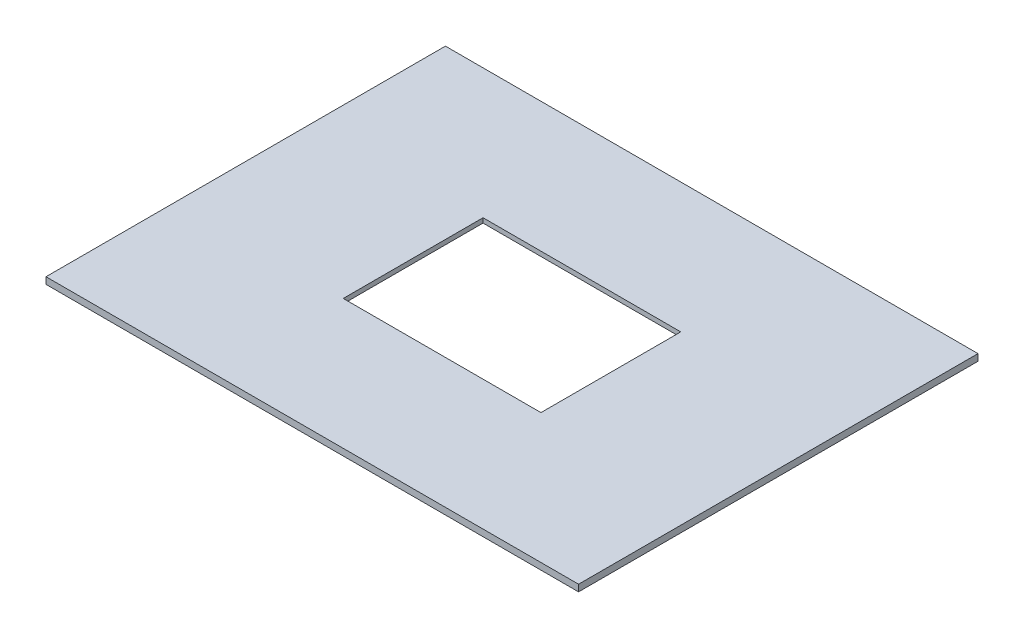
ISO-10303-21;
HEADER;
FILE_DESCRIPTION(('STEP AP214'),'2;1');
FILE_NAME('part.step','',(''),(''),'','','');
FILE_SCHEMA(('AUTOMOTIVE_DESIGN { 1 0 10303 214 1 1 1 1 }'));
ENDSEC;
DATA;
#1=APPLICATION_CONTEXT('core data for automotive mechanical design processes');
#2=APPLICATION_PROTOCOL_DEFINITION('international standard','automotive_design',2000,#1);
#3=PRODUCT_CONTEXT('',#1,'mechanical');
#4=PRODUCT('Part','Part','',(#3));
#5=PRODUCT_RELATED_PRODUCT_CATEGORY('part','',(#4));
#6=PRODUCT_DEFINITION_FORMATION('','',#4);
#7=PRODUCT_DEFINITION_CONTEXT('part definition',#1,'design');
#8=PRODUCT_DEFINITION('design','',#6,#7);
#9=PRODUCT_DEFINITION_SHAPE('','',#8);
#10=(LENGTH_UNIT() NAMED_UNIT(*) SI_UNIT(.MILLI.,.METRE.));
#11=(NAMED_UNIT(*) PLANE_ANGLE_UNIT() SI_UNIT($,.RADIAN.));
#12=(NAMED_UNIT(*) SI_UNIT($,.STERADIAN.) SOLID_ANGLE_UNIT());
#13=UNCERTAINTY_MEASURE_WITH_UNIT(LENGTH_MEASURE(1.E-05),#10,'distance_accuracy_value','');
#14=(GEOMETRIC_REPRESENTATION_CONTEXT(3) GLOBAL_UNCERTAINTY_ASSIGNED_CONTEXT((#13)) GLOBAL_UNIT_ASSIGNED_CONTEXT((#10,
#11,#12)) REPRESENTATION_CONTEXT('',''));
#15=CARTESIAN_POINT('',(0.,0.,0.));
#16=DIRECTION('',(0.,0.,1.));
#17=DIRECTION('',(1.,0.,0.));
#18=AXIS2_PLACEMENT_3D('',#15,#16,#17);
#19=CARTESIAN_POINT('',(400.,-10.,-300.));
#20=DIRECTION('',(0.,-1.,0.));
#21=DIRECTION('',(0.,0.,-1.));
#22=AXIS2_PLACEMENT_3D('',#19,#20,#21);
#23=PLANE('',#22);
#24=DIRECTION('',(0.,0.,-1.));
#25=VECTOR('',#24,1.);
#26=CARTESIAN_POINT('',(400.,-10.,300.));
#27=LINE('',#26,#25);
#28=CARTESIAN_POINT('',(400.,-10.,300.));
#29=VERTEX_POINT('',#28);
#30=CARTESIAN_POINT('',(400.,-10.,-300.));
#31=VERTEX_POINT('',#30);
#32=EDGE_CURVE('E278',#29,#31,#27,.T.);
#33=ORIENTED_EDGE('',*,*,#32,.F.);
#34=DIRECTION('',(1.,0.,0.));
#35=VECTOR('',#34,1.);
#36=CARTESIAN_POINT('',(-400.,-10.,300.));
#37=LINE('',#36,#35);
#38=CARTESIAN_POINT('',(-400.,-10.,300.));
#39=VERTEX_POINT('',#38);
#40=EDGE_CURVE('E288',#39,#29,#37,.T.);
#41=ORIENTED_EDGE('',*,*,#40,.F.);
#42=DIRECTION('',(0.,0.,1.));
#43=VECTOR('',#42,1.);
#44=CARTESIAN_POINT('',(-400.,-10.,300.));
#45=LINE('',#44,#43);
#46=CARTESIAN_POINT('',(-400.,-10.,-300.));
#47=VERTEX_POINT('',#46);
#48=EDGE_CURVE('E285',#47,#39,#45,.T.);
#49=ORIENTED_EDGE('',*,*,#48,.F.);
#50=DIRECTION('',(-1.,0.,0.));
#51=VECTOR('',#50,1.);
#52=CARTESIAN_POINT('',(-400.,-10.,-300.));
#53=LINE('',#52,#51);
#54=EDGE_CURVE('E281',#31,#47,#53,.T.);
#55=ORIENTED_EDGE('',*,*,#54,.F.);
#56=EDGE_LOOP('',(#33,#41,#49,#55));
#57=FACE_BOUND('',#56,.T.);
#58=DIRECTION('',(0.,0.,1.));
#59=VECTOR('',#58,1.);
#60=CARTESIAN_POINT('',(148.5,-10.,-115.));
#61=LINE('',#60,#59);
#62=CARTESIAN_POINT('',(148.5,-10.,-115.));
#63=VERTEX_POINT('',#62);
#64=CARTESIAN_POINT('',(148.5,-10.,-110.));
#65=VERTEX_POINT('',#64);
#66=EDGE_CURVE('E220',#63,#65,#61,.T.);
#67=ORIENTED_EDGE('',*,*,#66,.T.);
#68=DIRECTION('',(-1.,0.,0.));
#69=VECTOR('',#68,1.);
#70=CARTESIAN_POINT('',(-148.5,-10.,-110.));
#71=LINE('',#70,#69);
#72=CARTESIAN_POINT('',(-148.5,-10.,-110.));
#73=VERTEX_POINT('',#72);
#74=EDGE_CURVE('E176',#65,#73,#71,.T.);
#75=ORIENTED_EDGE('',*,*,#74,.T.);
#76=DIRECTION('',(0.,0.,1.));
#77=VECTOR('',#76,1.);
#78=CARTESIAN_POINT('',(-148.5,-10.,-115.));
#79=LINE('',#78,#77);
#80=CARTESIAN_POINT('',(-148.5,-10.,-115.));
#81=VERTEX_POINT('',#80);
#82=EDGE_CURVE('E185',#81,#73,#79,.T.);
#83=ORIENTED_EDGE('',*,*,#82,.F.);
#84=CARTESIAN_POINT('',(-151.,-10.,-115.));
#85=DIRECTION('',(0.,-1.,0.));
#86=DIRECTION('',(0.,0.,-1.));
#87=AXIS2_PLACEMENT_3D('',#84,#85,#86);
#88=CIRCLE('',#87,2.49999999999993);
#89=CARTESIAN_POINT('',(-153.5,-10.,-115.));
#90=VERTEX_POINT('',#89);
#91=EDGE_CURVE('E219',#90,#81,#88,.T.);
#92=ORIENTED_EDGE('',*,*,#91,.F.);
#93=DIRECTION('',(0.,0.,-1.));
#94=VECTOR('',#93,1.);
#95=CARTESIAN_POINT('',(-153.5,-10.,115.));
#96=LINE('',#95,#94);
#97=CARTESIAN_POINT('',(-153.5,-10.,115.));
#98=VERTEX_POINT('',#97);
#99=EDGE_CURVE('E203',#98,#90,#96,.T.);
#100=ORIENTED_EDGE('',*,*,#99,.F.);
#101=CARTESIAN_POINT('',(-151.,-10.,115.));
#102=DIRECTION('',(0.,-1.,0.));
#103=DIRECTION('',(0.,0.,1.));
#104=AXIS2_PLACEMENT_3D('',#101,#102,#103);
#105=CIRCLE('',#104,2.49999999999992);
#106=CARTESIAN_POINT('',(-148.5,-10.,115.));
#107=VERTEX_POINT('',#106);
#108=EDGE_CURVE('E205',#107,#98,#105,.T.);
#109=ORIENTED_EDGE('',*,*,#108,.F.);
#110=CARTESIAN_POINT('',(-148.5,-10.,110.));
#111=VERTEX_POINT('',#110);
#112=EDGE_CURVE('E563',#111,#107,#79,.T.);
#113=ORIENTED_EDGE('',*,*,#112,.F.);
#114=DIRECTION('',(-1.,0.,0.));
#115=VECTOR('',#114,1.);
#116=CARTESIAN_POINT('',(-148.5,-10.,110.));
#117=LINE('',#116,#115);
#118=CARTESIAN_POINT('',(148.5,-10.,110.));
#119=VERTEX_POINT('',#118);
#120=EDGE_CURVE('E249',#119,#111,#117,.T.);
#121=ORIENTED_EDGE('',*,*,#120,.F.);
#122=CARTESIAN_POINT('',(148.5,-10.,115.));
#123=VERTEX_POINT('',#122);
#124=EDGE_CURVE('E224',#119,#123,#61,.T.);
#125=ORIENTED_EDGE('',*,*,#124,.T.);
#126=CARTESIAN_POINT('',(151.,-10.,115.));
#127=DIRECTION('',(0.,1.,0.));
#128=DIRECTION('',(0.,0.,1.));
#129=AXIS2_PLACEMENT_3D('',#126,#127,#128);
#130=CIRCLE('',#129,2.49999999999992);
#131=CARTESIAN_POINT('',(153.5,-10.,115.));
#132=VERTEX_POINT('',#131);
#133=EDGE_CURVE('E225',#123,#132,#130,.T.);
#134=ORIENTED_EDGE('',*,*,#133,.T.);
#135=DIRECTION('',(0.,0.,-1.));
#136=VECTOR('',#135,1.);
#137=CARTESIAN_POINT('',(153.5,-10.,115.));
#138=LINE('',#137,#136);
#139=CARTESIAN_POINT('',(153.5,-10.,-115.));
#140=VERTEX_POINT('',#139);
#141=EDGE_CURVE('E228',#132,#140,#138,.T.);
#142=ORIENTED_EDGE('',*,*,#141,.T.);
#143=CARTESIAN_POINT('',(151.,-10.,-115.));
#144=DIRECTION('',(0.,1.,0.));
#145=DIRECTION('',(0.,0.,-1.));
#146=AXIS2_PLACEMENT_3D('',#143,#144,#145);
#147=CIRCLE('',#146,2.49999999999993);
#148=EDGE_CURVE('E231',#140,#63,#147,.T.);
#149=ORIENTED_EDGE('',*,*,#148,.T.);
#150=EDGE_LOOP('',(#67,#75,#83,#92,#100,#109,#113,#121,#125,#134,#142,#149));
#151=FACE_BOUND('',#150,.T.);
#152=ADVANCED_FACE('F31',(#57,#151),#23,.T.);
#153=CARTESIAN_POINT('',(-148.5,-7.,-115.));
#154=DIRECTION('',(1.,0.,0.));
#155=DIRECTION('',(0.,0.,-1.));
#156=AXIS2_PLACEMENT_3D('',#153,#154,#155);
#157=PLANE('',#156);
#158=DIRECTION('',(0.,-1.,0.));
#159=VECTOR('',#158,1.);
#160=CARTESIAN_POINT('',(-148.5,-7.,-110.));
#161=LINE('',#160,#159);
#162=CARTESIAN_POINT('',(-148.5,-7.,-110.));
#163=VERTEX_POINT('',#162);
#164=EDGE_CURVE('E170',#163,#73,#161,.T.);
#165=ORIENTED_EDGE('',*,*,#164,.F.);
#166=DIRECTION('',(0.,0.,1.));
#167=VECTOR('',#166,1.);
#168=CARTESIAN_POINT('',(-148.5,-7.,-115.));
#169=LINE('',#168,#167);
#170=CARTESIAN_POINT('',(-148.5,-7.,-115.));
#171=VERTEX_POINT('',#170);
#172=EDGE_CURVE('E182',#171,#163,#169,.T.);
#173=ORIENTED_EDGE('',*,*,#172,.F.);
#174=DIRECTION('',(0.,-1.,0.));
#175=VECTOR('',#174,1.);
#176=CARTESIAN_POINT('',(-148.5,-7.,-115.));
#177=LINE('',#176,#175);
#178=EDGE_CURVE('E577',#171,#81,#177,.T.);
#179=ORIENTED_EDGE('',*,*,#178,.T.);
#180=ORIENTED_EDGE('',*,*,#82,.T.);
#181=EDGE_LOOP('',(#165,#173,#179,#180));
#182=FACE_BOUND('',#181,.T.);
#183=ADVANCED_FACE('F181',(#182),#157,.F.);
#184=CARTESIAN_POINT('',(148.5,-7.,-115.));
#185=DIRECTION('',(1.,0.,0.));
#186=DIRECTION('',(0.,0.,-1.));
#187=AXIS2_PLACEMENT_3D('',#184,#185,#186);
#188=PLANE('',#187);
#189=DIRECTION('',(0.,0.,1.));
#190=VECTOR('',#189,1.);
#191=CARTESIAN_POINT('',(148.5,-7.,-115.));
#192=LINE('',#191,#190);
#193=CARTESIAN_POINT('',(148.5,-7.,-115.));
#194=VERTEX_POINT('',#193);
#195=CARTESIAN_POINT('',(148.5,-7.,-110.));
#196=VERTEX_POINT('',#195);
#197=EDGE_CURVE('E211',#194,#196,#192,.T.);
#198=ORIENTED_EDGE('',*,*,#197,.T.);
#199=DIRECTION('',(0.,-1.,0.));
#200=VECTOR('',#199,1.);
#201=CARTESIAN_POINT('',(148.5,-7.,-110.));
#202=LINE('',#201,#200);
#203=EDGE_CURVE('E173',#196,#65,#202,.T.);
#204=ORIENTED_EDGE('',*,*,#203,.T.);
#205=ORIENTED_EDGE('',*,*,#66,.F.);
#206=DIRECTION('',(0.,-1.,0.));
#207=VECTOR('',#206,1.);
#208=CARTESIAN_POINT('',(148.5,-7.,-115.));
#209=LINE('',#208,#207);
#210=EDGE_CURVE('E216',#194,#63,#209,.T.);
#211=ORIENTED_EDGE('',*,*,#210,.F.);
#212=EDGE_LOOP('',(#198,#204,#205,#211));
#213=FACE_BOUND('',#212,.T.);
#214=ADVANCED_FACE('F335',(#213),#188,.T.);
#215=CARTESIAN_POINT('',(148.5,-10.,105.));
#216=DIRECTION('',(1.,0.,0.));
#217=DIRECTION('',(0.,0.,-1.));
#218=AXIS2_PLACEMENT_3D('',#215,#216,#217);
#219=PLANE('',#218);
#220=CARTESIAN_POINT('',(148.5,-7.,-105.));
#221=VERTEX_POINT('',#220);
#222=CARTESIAN_POINT('',(148.5,-7.,105.));
#223=VERTEX_POINT('',#222);
#224=EDGE_CURVE('E236',#221,#223,#192,.T.);
#225=ORIENTED_EDGE('',*,*,#224,.T.);
#226=DIRECTION('',(0.,1.,0.));
#227=VECTOR('',#226,1.);
#228=CARTESIAN_POINT('',(148.5,-10.,105.));
#229=LINE('',#228,#227);
#230=CARTESIAN_POINT('',(148.5,0.,105.));
#231=VERTEX_POINT('',#230);
#232=EDGE_CURVE('E295',#223,#231,#229,.T.);
#233=ORIENTED_EDGE('',*,*,#232,.T.);
#234=DIRECTION('',(0.,0.,-1.));
#235=VECTOR('',#234,1.);
#236=CARTESIAN_POINT('',(148.5,0.,105.));
#237=LINE('',#236,#235);
#238=CARTESIAN_POINT('',(148.5,0.,-105.));
#239=VERTEX_POINT('',#238);
#240=EDGE_CURVE('E267',#231,#239,#237,.T.);
#241=ORIENTED_EDGE('',*,*,#240,.T.);
#242=DIRECTION('',(0.,1.,0.));
#243=VECTOR('',#242,1.);
#244=CARTESIAN_POINT('',(148.5,-10.,-105.));
#245=LINE('',#244,#243);
#246=EDGE_CURVE('E56',#221,#239,#245,.T.);
#247=ORIENTED_EDGE('',*,*,#246,.F.);
#248=EDGE_LOOP('',(#225,#233,#241,#247));
#249=FACE_BOUND('',#248,.T.);
#250=ADVANCED_FACE('F265',(#249),#219,.F.);
#251=CARTESIAN_POINT('',(-148.5,-10.,105.));
#252=DIRECTION('',(-1.,0.,0.));
#253=DIRECTION('',(0.,0.,1.));
#254=AXIS2_PLACEMENT_3D('',#251,#252,#253);
#255=PLANE('',#254);
#256=CARTESIAN_POINT('',(-148.5,-7.,-105.));
#257=VERTEX_POINT('',#256);
#258=CARTESIAN_POINT('',(-148.5,-7.,105.));
#259=VERTEX_POINT('',#258);
#260=EDGE_CURVE('E192',#257,#259,#169,.T.);
#261=ORIENTED_EDGE('',*,*,#260,.F.);
#262=DIRECTION('',(0.,1.,0.));
#263=VECTOR('',#262,1.);
#264=CARTESIAN_POINT('',(-148.5,-10.,-105.));
#265=LINE('',#264,#263);
#266=CARTESIAN_POINT('',(-148.5,0.,-105.));
#267=VERTEX_POINT('',#266);
#268=EDGE_CURVE('E259',#257,#267,#265,.T.);
#269=ORIENTED_EDGE('',*,*,#268,.T.);
#270=DIRECTION('',(0.,0.,1.));
#271=VECTOR('',#270,1.);
#272=CARTESIAN_POINT('',(-148.5,0.,105.));
#273=LINE('',#272,#271);
#274=CARTESIAN_POINT('',(-148.5,0.,105.));
#275=VERTEX_POINT('',#274);
#276=EDGE_CURVE('E274',#267,#275,#273,.T.);
#277=ORIENTED_EDGE('',*,*,#276,.T.);
#278=DIRECTION('',(0.,1.,0.));
#279=VECTOR('',#278,1.);
#280=CARTESIAN_POINT('',(-148.5,-10.,105.));
#281=LINE('',#280,#279);
#282=EDGE_CURVE('E271',#259,#275,#281,.T.);
#283=ORIENTED_EDGE('',*,*,#282,.F.);
#284=EDGE_LOOP('',(#261,#269,#277,#283));
#285=FACE_BOUND('',#284,.T.);
#286=ADVANCED_FACE('F361',(#285),#255,.F.);
#287=CARTESIAN_POINT('',(400.,-10.,300.));
#288=DIRECTION('',(1.,0.,0.));
#289=DIRECTION('',(0.,0.,-1.));
#290=AXIS2_PLACEMENT_3D('',#287,#288,#289);
#291=PLANE('',#290);
#292=DIRECTION('',(0.,0.,-1.));
#293=VECTOR('',#292,1.);
#294=CARTESIAN_POINT('',(400.,0.,300.));
#295=LINE('',#294,#293);
#296=CARTESIAN_POINT('',(400.,0.,300.));
#297=VERTEX_POINT('',#296);
#298=CARTESIAN_POINT('',(400.,0.,-300.));
#299=VERTEX_POINT('',#298);
#300=EDGE_CURVE('E291',#297,#299,#295,.T.);
#301=ORIENTED_EDGE('',*,*,#300,.F.);
#302=DIRECTION('',(0.,1.,0.));
#303=VECTOR('',#302,1.);
#304=CARTESIAN_POINT('',(400.,-10.,300.));
#305=LINE('',#304,#303);
#306=EDGE_CURVE('E11',#29,#297,#305,.T.);
#307=ORIENTED_EDGE('',*,*,#306,.F.);
#308=ORIENTED_EDGE('',*,*,#32,.T.);
#309=DIRECTION('',(0.,1.,0.));
#310=VECTOR('',#309,1.);
#311=CARTESIAN_POINT('',(400.,-10.,-300.));
#312=LINE('',#311,#310);
#313=EDGE_CURVE('E35',#31,#299,#312,.T.);
#314=ORIENTED_EDGE('',*,*,#313,.T.);
#315=EDGE_LOOP('',(#301,#307,#308,#314));
#316=FACE_BOUND('',#315,.T.);
#317=ADVANCED_FACE('F33',(#316),#291,.T.);
#318=CARTESIAN_POINT('',(-400.,-10.,300.));
#319=DIRECTION('',(0.,0.,1.));
#320=DIRECTION('',(1.,0.,0.));
#321=AXIS2_PLACEMENT_3D('',#318,#319,#320);
#322=PLANE('',#321);
#323=DIRECTION('',(1.,0.,0.));
#324=VECTOR('',#323,1.);
#325=CARTESIAN_POINT('',(-400.,0.,300.));
#326=LINE('',#325,#324);
#327=CARTESIAN_POINT('',(-400.,0.,300.));
#328=VERTEX_POINT('',#327);
#329=EDGE_CURVE('E282',#328,#297,#326,.T.);
#330=ORIENTED_EDGE('',*,*,#329,.F.);
#331=DIRECTION('',(0.,1.,0.));
#332=VECTOR('',#331,1.);
#333=CARTESIAN_POINT('',(-400.,-10.,300.));
#334=LINE('',#333,#332);
#335=EDGE_CURVE('E40',#39,#328,#334,.T.);
#336=ORIENTED_EDGE('',*,*,#335,.F.);
#337=ORIENTED_EDGE('',*,*,#40,.T.);
#338=ORIENTED_EDGE('',*,*,#306,.T.);
#339=EDGE_LOOP('',(#330,#336,#337,#338));
#340=FACE_BOUND('',#339,.T.);
#341=ADVANCED_FACE('F316',(#340),#322,.T.);
#342=CARTESIAN_POINT('',(-400.,-10.,300.));
#343=DIRECTION('',(-1.,0.,0.));
#344=DIRECTION('',(0.,0.,1.));
#345=AXIS2_PLACEMENT_3D('',#342,#343,#344);
#346=PLANE('',#345);
#347=DIRECTION('',(0.,0.,1.));
#348=VECTOR('',#347,1.);
#349=CARTESIAN_POINT('',(-400.,0.,300.));
#350=LINE('',#349,#348);
#351=CARTESIAN_POINT('',(-400.,0.,-300.));
#352=VERTEX_POINT('',#351);
#353=EDGE_CURVE('E298',#352,#328,#350,.T.);
#354=ORIENTED_EDGE('',*,*,#353,.F.);
#355=DIRECTION('',(0.,1.,0.));
#356=VECTOR('',#355,1.);
#357=CARTESIAN_POINT('',(-400.,-10.,-300.));
#358=LINE('',#357,#356);
#359=EDGE_CURVE('E303',#47,#352,#358,.T.);
#360=ORIENTED_EDGE('',*,*,#359,.F.);
#361=ORIENTED_EDGE('',*,*,#48,.T.);
#362=ORIENTED_EDGE('',*,*,#335,.T.);
#363=EDGE_LOOP('',(#354,#360,#361,#362));
#364=FACE_BOUND('',#363,.T.);
#365=ADVANCED_FACE('F322',(#364),#346,.T.);
#366=CARTESIAN_POINT('',(-400.,-10.,-300.));
#367=DIRECTION('',(0.,0.,-1.));
#368=DIRECTION('',(-1.,0.,0.));
#369=AXIS2_PLACEMENT_3D('',#366,#367,#368);
#370=PLANE('',#369);
#371=DIRECTION('',(-1.,0.,0.));
#372=VECTOR('',#371,1.);
#373=CARTESIAN_POINT('',(-400.,0.,-300.));
#374=LINE('',#373,#372);
#375=EDGE_CURVE('E294',#299,#352,#374,.T.);
#376=ORIENTED_EDGE('',*,*,#375,.F.);
#377=ORIENTED_EDGE('',*,*,#313,.F.);
#378=ORIENTED_EDGE('',*,*,#54,.T.);
#379=ORIENTED_EDGE('',*,*,#359,.T.);
#380=EDGE_LOOP('',(#376,#377,#378,#379));
#381=FACE_BOUND('',#380,.T.);
#382=ADVANCED_FACE('F311',(#381),#370,.T.);
#383=CARTESIAN_POINT('',(400.,0.,-300.));
#384=DIRECTION('',(0.,-1.,0.));
#385=DIRECTION('',(0.,0.,-1.));
#386=AXIS2_PLACEMENT_3D('',#383,#384,#385);
#387=PLANE('',#386);
#388=DIRECTION('',(-1.,0.,0.));
#389=VECTOR('',#388,1.);
#390=CARTESIAN_POINT('',(-148.5,0.,-105.));
#391=LINE('',#390,#389);
#392=EDGE_CURVE('E350',#239,#267,#391,.T.);
#393=ORIENTED_EDGE('',*,*,#392,.F.);
#394=ORIENTED_EDGE('',*,*,#240,.F.);
#395=DIRECTION('',(1.,0.,0.));
#396=VECTOR('',#395,1.);
#397=CARTESIAN_POINT('',(-148.5,0.,105.));
#398=LINE('',#397,#396);
#399=EDGE_CURVE('E269',#275,#231,#398,.T.);
#400=ORIENTED_EDGE('',*,*,#399,.F.);
#401=ORIENTED_EDGE('',*,*,#276,.F.);
#402=EDGE_LOOP('',(#393,#394,#400,#401));
#403=FACE_BOUND('',#402,.T.);
#404=ORIENTED_EDGE('',*,*,#300,.T.);
#405=ORIENTED_EDGE('',*,*,#375,.T.);
#406=ORIENTED_EDGE('',*,*,#353,.T.);
#407=ORIENTED_EDGE('',*,*,#329,.T.);
#408=EDGE_LOOP('',(#404,#405,#406,#407));
#409=FACE_BOUND('',#408,.T.);
#410=ADVANCED_FACE('F313',(#403,#409),#387,.F.);
#411=CARTESIAN_POINT('',(-148.5,-10.,105.));
#412=DIRECTION('',(0.,0.,1.));
#413=DIRECTION('',(1.,0.,0.));
#414=AXIS2_PLACEMENT_3D('',#411,#412,#413);
#415=PLANE('',#414);
#416=ORIENTED_EDGE('',*,*,#232,.F.);
#417=DIRECTION('',(1.,0.,0.));
#418=VECTOR('',#417,1.);
#419=CARTESIAN_POINT('',(-148.5,-7.,105.));
#420=LINE('',#419,#418);
#421=EDGE_CURVE('E251',#259,#223,#420,.T.);
#422=ORIENTED_EDGE('',*,*,#421,.F.);
#423=ORIENTED_EDGE('',*,*,#282,.T.);
#424=ORIENTED_EDGE('',*,*,#399,.T.);
#425=EDGE_LOOP('',(#416,#422,#423,#424));
#426=FACE_BOUND('',#425,.T.);
#427=ADVANCED_FACE('F342',(#426),#415,.F.);
#428=CARTESIAN_POINT('',(-148.5,-10.,-105.));
#429=DIRECTION('',(0.,0.,-1.));
#430=DIRECTION('',(-1.,0.,0.));
#431=AXIS2_PLACEMENT_3D('',#428,#429,#430);
#432=PLANE('',#431);
#433=ORIENTED_EDGE('',*,*,#268,.F.);
#434=DIRECTION('',(1.,0.,0.));
#435=VECTOR('',#434,1.);
#436=CARTESIAN_POINT('',(-148.5,-7.,-105.));
#437=LINE('',#436,#435);
#438=EDGE_CURVE('E175',#257,#221,#437,.T.);
#439=ORIENTED_EDGE('',*,*,#438,.T.);
#440=ORIENTED_EDGE('',*,*,#246,.T.);
#441=ORIENTED_EDGE('',*,*,#392,.T.);
#442=EDGE_LOOP('',(#433,#439,#440,#441));
#443=FACE_BOUND('',#442,.T.);
#444=ADVANCED_FACE('F258',(#443),#432,.F.);
#445=CARTESIAN_POINT('',(-148.5,-7.,110.));
#446=VERTEX_POINT('',#445);
#447=CARTESIAN_POINT('',(-148.5,-7.,115.));
#448=VERTEX_POINT('',#447);
#449=EDGE_CURVE('E194',#446,#448,#169,.T.);
#450=ORIENTED_EDGE('',*,*,#449,.F.);
#451=DIRECTION('',(0.,-1.,0.));
#452=VECTOR('',#451,1.);
#453=CARTESIAN_POINT('',(-148.5,-7.,110.));
#454=LINE('',#453,#452);
#455=EDGE_CURVE('E234',#446,#111,#454,.T.);
#456=ORIENTED_EDGE('',*,*,#455,.T.);
#457=ORIENTED_EDGE('',*,*,#112,.T.);
#458=DIRECTION('',(0.,-1.,0.));
#459=VECTOR('',#458,1.);
#460=CARTESIAN_POINT('',(-148.5,-7.,115.));
#461=LINE('',#460,#459);
#462=EDGE_CURVE('E576',#448,#107,#461,.T.);
#463=ORIENTED_EDGE('',*,*,#462,.F.);
#464=EDGE_LOOP('',(#450,#456,#457,#463));
#465=FACE_BOUND('',#464,.T.);
#466=ADVANCED_FACE('F337',(#465),#157,.F.);
#467=CARTESIAN_POINT('',(-151.,-7.,-115.));
#468=DIRECTION('',(0.,-1.,0.));
#469=DIRECTION('',(0.,0.,-1.));
#470=AXIS2_PLACEMENT_3D('',#467,#468,#469);
#471=CYLINDRICAL_SURFACE('',#470,2.49999999999993);
#472=ORIENTED_EDGE('',*,*,#91,.T.);
#473=ORIENTED_EDGE('',*,*,#178,.F.);
#474=CARTESIAN_POINT('',(-151.,-7.,-115.));
#475=DIRECTION('',(0.,-1.,0.));
#476=DIRECTION('',(0.,0.,-1.));
#477=AXIS2_PLACEMENT_3D('',#474,#475,#476);
#478=CIRCLE('',#477,2.49999999999993);
#479=CARTESIAN_POINT('',(-153.5,-7.,-115.));
#480=VERTEX_POINT('',#479);
#481=EDGE_CURVE('E190',#480,#171,#478,.T.);
#482=ORIENTED_EDGE('',*,*,#481,.F.);
#483=DIRECTION('',(0.,-1.,0.));
#484=VECTOR('',#483,1.);
#485=CARTESIAN_POINT('',(-153.5,-7.,-115.));
#486=LINE('',#485,#484);
#487=EDGE_CURVE('E355',#480,#90,#486,.T.);
#488=ORIENTED_EDGE('',*,*,#487,.T.);
#489=EDGE_LOOP('',(#472,#473,#482,#488));
#490=FACE_BOUND('',#489,.T.);
#491=ADVANCED_FACE('F373',(#490),#471,.F.);
#492=CARTESIAN_POINT('',(-153.5,-7.,115.));
#493=DIRECTION('',(-1.,0.,0.));
#494=DIRECTION('',(0.,0.,1.));
#495=AXIS2_PLACEMENT_3D('',#492,#493,#494);
#496=PLANE('',#495);
#497=ORIENTED_EDGE('',*,*,#99,.T.);
#498=ORIENTED_EDGE('',*,*,#487,.F.);
#499=DIRECTION('',(0.,0.,-1.));
#500=VECTOR('',#499,1.);
#501=CARTESIAN_POINT('',(-153.5,-7.,115.));
#502=LINE('',#501,#500);
#503=CARTESIAN_POINT('',(-153.5,-7.,115.));
#504=VERTEX_POINT('',#503);
#505=EDGE_CURVE('E196',#504,#480,#502,.T.);
#506=ORIENTED_EDGE('',*,*,#505,.F.);
#507=DIRECTION('',(0.,-1.,0.));
#508=VECTOR('',#507,1.);
#509=CARTESIAN_POINT('',(-153.5,-7.,115.));
#510=LINE('',#509,#508);
#511=EDGE_CURVE('E574',#504,#98,#510,.T.);
#512=ORIENTED_EDGE('',*,*,#511,.T.);
#513=EDGE_LOOP('',(#497,#498,#506,#512));
#514=FACE_BOUND('',#513,.T.);
#515=ADVANCED_FACE('F378',(#514),#496,.F.);
#516=CARTESIAN_POINT('',(-151.,-7.,115.));
#517=DIRECTION('',(0.,-1.,0.));
#518=DIRECTION('',(0.,0.,-1.));
#519=AXIS2_PLACEMENT_3D('',#516,#517,#518);
#520=CYLINDRICAL_SURFACE('',#519,2.49999999999992);
#521=ORIENTED_EDGE('',*,*,#108,.T.);
#522=ORIENTED_EDGE('',*,*,#511,.F.);
#523=CARTESIAN_POINT('',(-151.,-7.,115.));
#524=DIRECTION('',(0.,-1.,0.));
#525=DIRECTION('',(0.,0.,1.));
#526=AXIS2_PLACEMENT_3D('',#523,#524,#525);
#527=CIRCLE('',#526,2.49999999999992);
#528=EDGE_CURVE('E191',#448,#504,#527,.T.);
#529=ORIENTED_EDGE('',*,*,#528,.F.);
#530=ORIENTED_EDGE('',*,*,#462,.T.);
#531=EDGE_LOOP('',(#521,#522,#529,#530));
#532=FACE_BOUND('',#531,.T.);
#533=ADVANCED_FACE('F381',(#532),#520,.F.);
#534=CARTESIAN_POINT('',(-151.,-7.,-115.));
#535=DIRECTION('',(0.,-1.,0.));
#536=DIRECTION('',(0.,0.,-1.));
#537=AXIS2_PLACEMENT_3D('',#534,#535,#536);
#538=PLANE('',#537);
#539=ORIENTED_EDGE('',*,*,#438,.F.);
#540=ORIENTED_EDGE('',*,*,#260,.T.);
#541=ORIENTED_EDGE('',*,*,#421,.T.);
#542=ORIENTED_EDGE('',*,*,#224,.F.);
#543=EDGE_LOOP('',(#539,#540,#541,#542));
#544=FACE_BOUND('',#543,.T.);
#545=ORIENTED_EDGE('',*,*,#481,.T.);
#546=ORIENTED_EDGE('',*,*,#172,.T.);
#547=DIRECTION('',(-1.,0.,0.));
#548=VECTOR('',#547,1.);
#549=CARTESIAN_POINT('',(-148.5,-7.,-110.));
#550=LINE('',#549,#548);
#551=EDGE_CURVE('E48',#196,#163,#550,.T.);
#552=ORIENTED_EDGE('',*,*,#551,.F.);
#553=ORIENTED_EDGE('',*,*,#197,.F.);
#554=CARTESIAN_POINT('',(151.,-7.,-115.));
#555=DIRECTION('',(0.,1.,0.));
#556=DIRECTION('',(0.,0.,-1.));
#557=AXIS2_PLACEMENT_3D('',#554,#555,#556);
#558=CIRCLE('',#557,2.49999999999993);
#559=CARTESIAN_POINT('',(153.5,-7.,-115.));
#560=VERTEX_POINT('',#559);
#561=EDGE_CURVE('E223',#560,#194,#558,.T.);
#562=ORIENTED_EDGE('',*,*,#561,.F.);
#563=DIRECTION('',(0.,0.,-1.));
#564=VECTOR('',#563,1.);
#565=CARTESIAN_POINT('',(153.5,-7.,115.));
#566=LINE('',#565,#564);
#567=CARTESIAN_POINT('',(153.5,-7.,115.));
#568=VERTEX_POINT('',#567);
#569=EDGE_CURVE('E240',#568,#560,#566,.T.);
#570=ORIENTED_EDGE('',*,*,#569,.F.);
#571=CARTESIAN_POINT('',(151.,-7.,115.));
#572=DIRECTION('',(0.,1.,0.));
#573=DIRECTION('',(0.,0.,1.));
#574=AXIS2_PLACEMENT_3D('',#571,#572,#573);
#575=CIRCLE('',#574,2.49999999999992);
#576=CARTESIAN_POINT('',(148.5,-7.,115.));
#577=VERTEX_POINT('',#576);
#578=EDGE_CURVE('E238',#577,#568,#575,.T.);
#579=ORIENTED_EDGE('',*,*,#578,.F.);
#580=CARTESIAN_POINT('',(148.5,-7.,110.));
#581=VERTEX_POINT('',#580);
#582=EDGE_CURVE('E237',#581,#577,#192,.T.);
#583=ORIENTED_EDGE('',*,*,#582,.F.);
#584=DIRECTION('',(-1.,0.,0.));
#585=VECTOR('',#584,1.);
#586=CARTESIAN_POINT('',(-148.5,-7.,110.));
#587=LINE('',#586,#585);
#588=EDGE_CURVE('E246',#581,#446,#587,.T.);
#589=ORIENTED_EDGE('',*,*,#588,.T.);
#590=ORIENTED_EDGE('',*,*,#449,.T.);
#591=ORIENTED_EDGE('',*,*,#528,.T.);
#592=ORIENTED_EDGE('',*,*,#505,.T.);
#593=EDGE_LOOP('',(#545,#546,#552,#553,#562,#570,#579,#583,#589,#590,#591,#592));
#594=FACE_BOUND('',#593,.T.);
#595=ADVANCED_FACE('F187',(#544,#594),#538,.T.);
#596=DIRECTION('',(0.,-1.,0.));
#597=VECTOR('',#596,1.);
#598=CARTESIAN_POINT('',(148.5,-7.,110.));
#599=LINE('',#598,#597);
#600=EDGE_CURVE('E244',#581,#119,#599,.T.);
#601=ORIENTED_EDGE('',*,*,#600,.F.);
#602=ORIENTED_EDGE('',*,*,#582,.T.);
#603=DIRECTION('',(0.,-1.,0.));
#604=VECTOR('',#603,1.);
#605=CARTESIAN_POINT('',(148.5,-7.,115.));
#606=LINE('',#605,#604);
#607=EDGE_CURVE('E213',#577,#123,#606,.T.);
#608=ORIENTED_EDGE('',*,*,#607,.T.);
#609=ORIENTED_EDGE('',*,*,#124,.F.);
#610=EDGE_LOOP('',(#601,#602,#608,#609));
#611=FACE_BOUND('',#610,.T.);
#612=ADVANCED_FACE('F390',(#611),#188,.T.);
#613=CARTESIAN_POINT('',(151.,-7.,-115.));
#614=DIRECTION('',(0.,-1.,0.));
#615=DIRECTION('',(0.,0.,-1.));
#616=AXIS2_PLACEMENT_3D('',#613,#614,#615);
#617=CYLINDRICAL_SURFACE('',#616,2.49999999999993);
#618=ORIENTED_EDGE('',*,*,#148,.F.);
#619=DIRECTION('',(0.,-1.,0.));
#620=VECTOR('',#619,1.);
#621=CARTESIAN_POINT('',(153.5,-7.,-115.));
#622=LINE('',#621,#620);
#623=EDGE_CURVE('E208',#560,#140,#622,.T.);
#624=ORIENTED_EDGE('',*,*,#623,.F.);
#625=ORIENTED_EDGE('',*,*,#561,.T.);
#626=ORIENTED_EDGE('',*,*,#210,.T.);
#627=EDGE_LOOP('',(#618,#624,#625,#626));
#628=FACE_BOUND('',#627,.T.);
#629=ADVANCED_FACE('F391',(#628),#617,.F.);
#630=CARTESIAN_POINT('',(151.,-7.,115.));
#631=DIRECTION('',(0.,-1.,0.));
#632=DIRECTION('',(0.,0.,-1.));
#633=AXIS2_PLACEMENT_3D('',#630,#631,#632);
#634=CYLINDRICAL_SURFACE('',#633,2.49999999999992);
#635=ORIENTED_EDGE('',*,*,#133,.F.);
#636=ORIENTED_EDGE('',*,*,#607,.F.);
#637=ORIENTED_EDGE('',*,*,#578,.T.);
#638=DIRECTION('',(0.,-1.,0.));
#639=VECTOR('',#638,1.);
#640=CARTESIAN_POINT('',(153.5,-7.,115.));
#641=LINE('',#640,#639);
#642=EDGE_CURVE('E210',#568,#132,#641,.T.);
#643=ORIENTED_EDGE('',*,*,#642,.T.);
#644=EDGE_LOOP('',(#635,#636,#637,#643));
#645=FACE_BOUND('',#644,.T.);
#646=ADVANCED_FACE('F394',(#645),#634,.F.);
#647=CARTESIAN_POINT('',(153.5,-7.,115.));
#648=DIRECTION('',(-1.,0.,0.));
#649=DIRECTION('',(0.,0.,1.));
#650=AXIS2_PLACEMENT_3D('',#647,#648,#649);
#651=PLANE('',#650);
#652=ORIENTED_EDGE('',*,*,#141,.F.);
#653=ORIENTED_EDGE('',*,*,#642,.F.);
#654=ORIENTED_EDGE('',*,*,#569,.T.);
#655=ORIENTED_EDGE('',*,*,#623,.T.);
#656=EDGE_LOOP('',(#652,#653,#654,#655));
#657=FACE_BOUND('',#656,.T.);
#658=ADVANCED_FACE('F396',(#657),#651,.T.);
#659=CARTESIAN_POINT('',(-148.5,-7.,110.));
#660=DIRECTION('',(0.,0.,1.));
#661=DIRECTION('',(1.,0.,0.));
#662=AXIS2_PLACEMENT_3D('',#659,#660,#661);
#663=PLANE('',#662);
#664=ORIENTED_EDGE('',*,*,#120,.T.);
#665=ORIENTED_EDGE('',*,*,#455,.F.);
#666=ORIENTED_EDGE('',*,*,#588,.F.);
#667=ORIENTED_EDGE('',*,*,#600,.T.);
#668=EDGE_LOOP('',(#664,#665,#666,#667));
#669=FACE_BOUND('',#668,.T.);
#670=ADVANCED_FACE('F399',(#669),#663,.F.);
#671=CARTESIAN_POINT('',(-148.5,-7.,-110.));
#672=DIRECTION('',(0.,0.,1.));
#673=DIRECTION('',(1.,0.,0.));
#674=AXIS2_PLACEMENT_3D('',#671,#672,#673);
#675=PLANE('',#674);
#676=ORIENTED_EDGE('',*,*,#74,.F.);
#677=ORIENTED_EDGE('',*,*,#203,.F.);
#678=ORIENTED_EDGE('',*,*,#551,.T.);
#679=ORIENTED_EDGE('',*,*,#164,.T.);
#680=EDGE_LOOP('',(#676,#677,#678,#679));
#681=FACE_BOUND('',#680,.T.);
#682=ADVANCED_FACE('F169',(#681),#675,.T.);
#683=CLOSED_SHELL('',(#152,#183,#214,#250,#286,#317,#341,#365,#382,#410,#427,#444,#466,#491,
#515,#533,#595,#612,#629,#646,#658,#670,#682));
#684=MANIFOLD_SOLID_BREP('B2',#683);
#685=ADVANCED_BREP_SHAPE_REPRESENTATION('',(#18,#684),#14);
#686=SHAPE_DEFINITION_REPRESENTATION(#9,#685);
ENDSEC;
END-ISO-10303-21;
